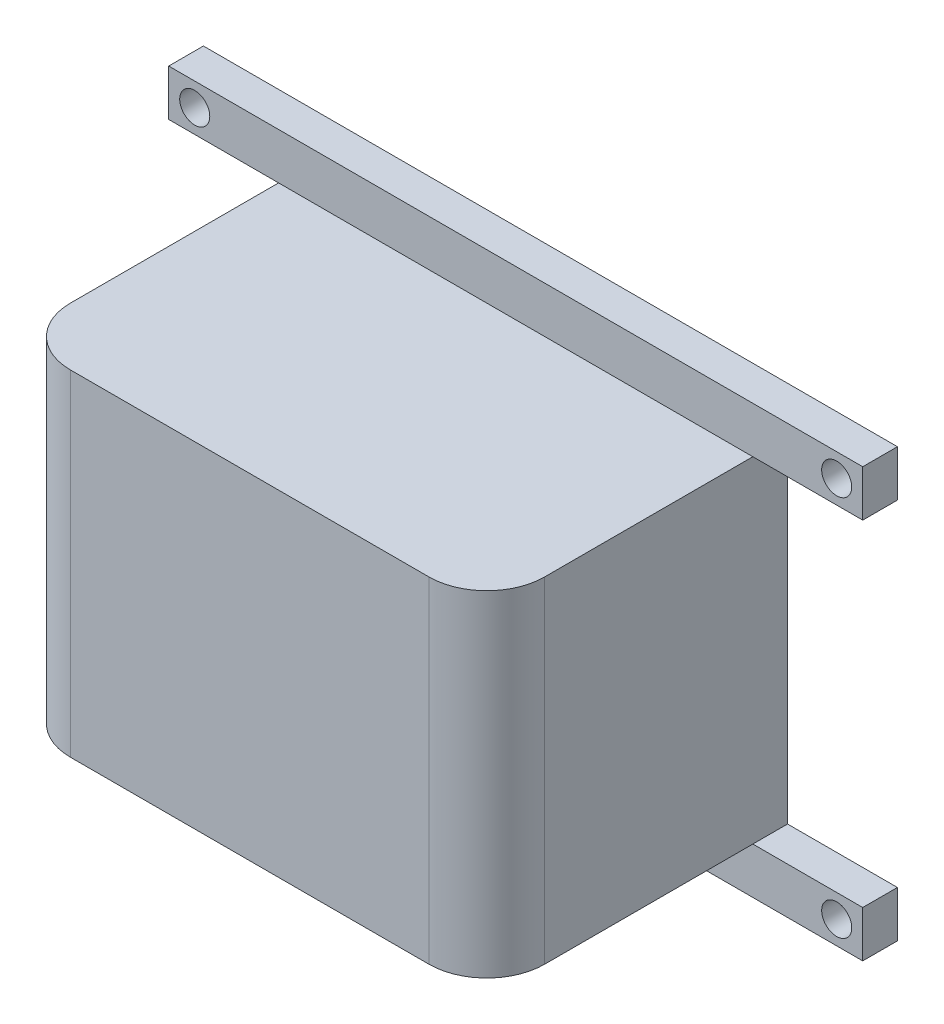
ISO-10303-21;
HEADER;
FILE_DESCRIPTION(('STEP AP214'),'2;1');
FILE_NAME('part.step','',(''),(''),'','','');
FILE_SCHEMA(('AUTOMOTIVE_DESIGN { 1 0 10303 214 1 1 1 1 }'));
ENDSEC;
DATA;
#1=APPLICATION_CONTEXT('core data for automotive mechanical design processes');
#2=APPLICATION_PROTOCOL_DEFINITION('international standard','automotive_design',2000,#1);
#3=PRODUCT_CONTEXT('',#1,'mechanical');
#4=PRODUCT('Part','Part','',(#3));
#5=PRODUCT_RELATED_PRODUCT_CATEGORY('part','',(#4));
#6=PRODUCT_DEFINITION_FORMATION('','',#4);
#7=PRODUCT_DEFINITION_CONTEXT('part definition',#1,'design');
#8=PRODUCT_DEFINITION('design','',#6,#7);
#9=PRODUCT_DEFINITION_SHAPE('','',#8);
#10=(LENGTH_UNIT() NAMED_UNIT(*) SI_UNIT(.MILLI.,.METRE.));
#11=(NAMED_UNIT(*) PLANE_ANGLE_UNIT() SI_UNIT($,.RADIAN.));
#12=(NAMED_UNIT(*) SI_UNIT($,.STERADIAN.) SOLID_ANGLE_UNIT());
#13=UNCERTAINTY_MEASURE_WITH_UNIT(LENGTH_MEASURE(1.E-05),#10,'distance_accuracy_value','');
#14=(GEOMETRIC_REPRESENTATION_CONTEXT(3) GLOBAL_UNCERTAINTY_ASSIGNED_CONTEXT((#13)) GLOBAL_UNIT_ASSIGNED_CONTEXT((#10,
#11,#12)) REPRESENTATION_CONTEXT('',''));
#15=CARTESIAN_POINT('',(0.,0.,0.));
#16=DIRECTION('',(0.,0.,1.));
#17=DIRECTION('',(1.,0.,0.));
#18=AXIS2_PLACEMENT_3D('',#15,#16,#17);
#19=CARTESIAN_POINT('',(0.,0.,30.));
#20=DIRECTION('',(0.,0.,1.));
#21=DIRECTION('',(1.,0.,0.));
#22=AXIS2_PLACEMENT_3D('',#19,#20,#21);
#23=PLANE('',#22);
#24=DIRECTION('',(-1.,0.,0.));
#25=VECTOR('',#24,1.);
#26=CARTESIAN_POINT('',(205.,145.,30.));
#27=LINE('',#26,#25);
#28=CARTESIAN_POINT('',(205.,145.,30.));
#29=VERTEX_POINT('',#28);
#30=CARTESIAN_POINT('',(-205.,145.,30.));
#31=VERTEX_POINT('',#30);
#32=EDGE_CURVE('E176',#29,#31,#27,.T.);
#33=ORIENTED_EDGE('',*,*,#32,.F.);
#34=DIRECTION('',(1.,0.,0.));
#35=VECTOR('',#34,1.);
#36=CARTESIAN_POINT('',(300.,145.,30.));
#37=LINE('',#36,#35);
#38=CARTESIAN_POINT('',(300.,145.,30.));
#39=VERTEX_POINT('',#38);
#40=EDGE_CURVE('E173',#29,#39,#37,.T.);
#41=ORIENTED_EDGE('',*,*,#40,.T.);
#42=DIRECTION('',(0.,1.,0.));
#43=VECTOR('',#42,1.);
#44=CARTESIAN_POINT('',(300.,185.,30.));
#45=LINE('',#44,#43);
#46=CARTESIAN_POINT('',(300.,185.,30.));
#47=VERTEX_POINT('',#46);
#48=EDGE_CURVE('E217',#39,#47,#45,.T.);
#49=ORIENTED_EDGE('',*,*,#48,.T.);
#50=DIRECTION('',(-1.,0.,0.));
#51=VECTOR('',#50,1.);
#52=CARTESIAN_POINT('',(300.,185.,30.));
#53=LINE('',#52,#51);
#54=CARTESIAN_POINT('',(-300.,185.,30.));
#55=VERTEX_POINT('',#54);
#56=EDGE_CURVE('E219',#47,#55,#53,.T.);
#57=ORIENTED_EDGE('',*,*,#56,.T.);
#58=DIRECTION('',(0.,-1.,0.));
#59=VECTOR('',#58,1.);
#60=CARTESIAN_POINT('',(-300.,185.,30.));
#61=LINE('',#60,#59);
#62=CARTESIAN_POINT('',(-300.,145.,30.));
#63=VERTEX_POINT('',#62);
#64=EDGE_CURVE('E221',#55,#63,#61,.T.);
#65=ORIENTED_EDGE('',*,*,#64,.T.);
#66=DIRECTION('',(1.,0.,0.));
#67=VECTOR('',#66,1.);
#68=CARTESIAN_POINT('',(-300.,145.,30.));
#69=LINE('',#68,#67);
#70=EDGE_CURVE('E223',#63,#31,#69,.T.);
#71=ORIENTED_EDGE('',*,*,#70,.T.);
#72=EDGE_LOOP('',(#33,#41,#49,#57,#65,#71));
#73=FACE_BOUND('',#72,.T.);
#74=CARTESIAN_POINT('',(-277.5,165.,30.));
#75=DIRECTION('',(0.,0.,1.));
#76=DIRECTION('',(1.,0.,0.));
#77=AXIS2_PLACEMENT_3D('',#74,#75,#76);
#78=CIRCLE('',#77,13.);
#79=CARTESIAN_POINT('',(-264.5,165.,30.));
#80=VERTEX_POINT('',#79);
#81=EDGE_CURVE('E201',#80,#80,#78,.T.);
#82=ORIENTED_EDGE('',*,*,#81,.F.);
#83=EDGE_LOOP('',(#82));
#84=FACE_BOUND('',#83,.T.);
#85=CARTESIAN_POINT('',(277.5,165.,30.));
#86=DIRECTION('',(0.,0.,1.));
#87=DIRECTION('',(1.,0.,0.));
#88=AXIS2_PLACEMENT_3D('',#85,#86,#87);
#89=CIRCLE('',#88,13.);
#90=CARTESIAN_POINT('',(290.5,165.,30.));
#91=VERTEX_POINT('',#90);
#92=EDGE_CURVE('E204',#91,#91,#89,.T.);
#93=ORIENTED_EDGE('',*,*,#92,.F.);
#94=EDGE_LOOP('',(#93));
#95=FACE_BOUND('',#94,.T.);
#96=ADVANCED_FACE('F33',(#73,#84,#95),#23,.T.);
#97=CARTESIAN_POINT('',(300.,-185.,30.));
#98=DIRECTION('',(-1.,0.,0.));
#99=DIRECTION('',(0.,-1.,0.));
#100=AXIS2_PLACEMENT_3D('',#97,#98,#99);
#101=PLANE('',#100);
#102=DIRECTION('',(0.,1.,0.));
#103=VECTOR('',#102,1.);
#104=CARTESIAN_POINT('',(300.,-185.,0.));
#105=LINE('',#104,#103);
#106=CARTESIAN_POINT('',(300.,-185.,0.));
#107=VERTEX_POINT('',#106);
#108=CARTESIAN_POINT('',(300.,-145.,0.));
#109=VERTEX_POINT('',#108);
#110=EDGE_CURVE('E213',#107,#109,#105,.T.);
#111=ORIENTED_EDGE('',*,*,#110,.T.);
#112=DIRECTION('',(0.,0.,-1.));
#113=VECTOR('',#112,1.);
#114=CARTESIAN_POINT('',(300.,-145.,30.));
#115=LINE('',#114,#113);
#116=CARTESIAN_POINT('',(300.,-145.,30.));
#117=VERTEX_POINT('',#116);
#118=EDGE_CURVE('E161',#117,#109,#115,.T.);
#119=ORIENTED_EDGE('',*,*,#118,.F.);
#120=DIRECTION('',(0.,1.,0.));
#121=VECTOR('',#120,1.);
#122=CARTESIAN_POINT('',(300.,-185.,30.));
#123=LINE('',#122,#121);
#124=CARTESIAN_POINT('',(300.,-185.,30.));
#125=VERTEX_POINT('',#124);
#126=EDGE_CURVE('E171',#125,#117,#123,.T.);
#127=ORIENTED_EDGE('',*,*,#126,.F.);
#128=DIRECTION('',(0.,0.,-1.));
#129=VECTOR('',#128,1.);
#130=CARTESIAN_POINT('',(300.,-185.,30.));
#131=LINE('',#130,#129);
#132=EDGE_CURVE('E232',#125,#107,#131,.T.);
#133=ORIENTED_EDGE('',*,*,#132,.T.);
#134=EDGE_LOOP('',(#111,#119,#127,#133));
#135=FACE_BOUND('',#134,.T.);
#136=ADVANCED_FACE('F343',(#135),#101,.F.);
#137=CARTESIAN_POINT('',(300.,-145.,30.));
#138=DIRECTION('',(0.,-1.,0.));
#139=DIRECTION('',(1.,0.,0.));
#140=AXIS2_PLACEMENT_3D('',#137,#138,#139);
#141=PLANE('',#140);
#142=DIRECTION('',(-1.,0.,0.));
#143=VECTOR('',#142,1.);
#144=CARTESIAN_POINT('',(300.,-145.,0.));
#145=LINE('',#144,#143);
#146=CARTESIAN_POINT('',(205.,-145.,0.));
#147=VERTEX_POINT('',#146);
#148=EDGE_CURVE('E160',#109,#147,#145,.T.);
#149=ORIENTED_EDGE('',*,*,#148,.T.);
#150=DIRECTION('',(0.,0.,-1.));
#151=VECTOR('',#150,1.);
#152=CARTESIAN_POINT('',(205.,-145.,30.));
#153=LINE('',#152,#151);
#154=CARTESIAN_POINT('',(205.,-145.,30.));
#155=VERTEX_POINT('',#154);
#156=EDGE_CURVE('E147',#155,#147,#153,.T.);
#157=ORIENTED_EDGE('',*,*,#156,.F.);
#158=DIRECTION('',(-1.,0.,0.));
#159=VECTOR('',#158,1.);
#160=CARTESIAN_POINT('',(300.,-145.,30.));
#161=LINE('',#160,#159);
#162=EDGE_CURVE('E158',#117,#155,#161,.T.);
#163=ORIENTED_EDGE('',*,*,#162,.F.);
#164=ORIENTED_EDGE('',*,*,#118,.T.);
#165=EDGE_LOOP('',(#149,#157,#163,#164));
#166=FACE_BOUND('',#165,.T.);
#167=ADVANCED_FACE('F156',(#166),#141,.F.);
#168=CARTESIAN_POINT('',(205.,145.,30.));
#169=DIRECTION('',(-1.,0.,0.));
#170=DIRECTION('',(0.,-1.,0.));
#171=AXIS2_PLACEMENT_3D('',#168,#169,#170);
#172=PLANE('',#171);
#173=DIRECTION('',(0.,0.,-1.));
#174=VECTOR('',#173,1.);
#175=CARTESIAN_POINT('',(205.,145.,260.));
#176=LINE('',#175,#174);
#177=CARTESIAN_POINT('',(205.,145.,210.));
#178=VERTEX_POINT('',#177);
#179=EDGE_CURVE('E152',#178,#29,#176,.T.);
#180=ORIENTED_EDGE('',*,*,#179,.F.);
#181=DIRECTION('',(0.,1.,0.));
#182=VECTOR('',#181,1.);
#183=CARTESIAN_POINT('',(205.,145.,210.));
#184=LINE('',#183,#182);
#185=CARTESIAN_POINT('',(205.,-145.,210.));
#186=VERTEX_POINT('',#185);
#187=EDGE_CURVE('E56',#178,#186,#184,.F.);
#188=ORIENTED_EDGE('',*,*,#187,.T.);
#189=DIRECTION('',(0.,0.,-1.));
#190=VECTOR('',#189,1.);
#191=CARTESIAN_POINT('',(205.,-145.,260.));
#192=LINE('',#191,#190);
#193=EDGE_CURVE('E144',#186,#155,#192,.T.);
#194=ORIENTED_EDGE('',*,*,#193,.T.);
#195=ORIENTED_EDGE('',*,*,#156,.T.);
#196=DIRECTION('',(0.,1.,0.));
#197=VECTOR('',#196,1.);
#198=CARTESIAN_POINT('',(205.,145.,0.));
#199=LINE('',#198,#197);
#200=CARTESIAN_POINT('',(205.,145.,0.));
#201=VERTEX_POINT('',#200);
#202=EDGE_CURVE('E236',#147,#201,#199,.T.);
#203=ORIENTED_EDGE('',*,*,#202,.T.);
#204=DIRECTION('',(0.,0.,-1.));
#205=VECTOR('',#204,1.);
#206=CARTESIAN_POINT('',(205.,145.,30.));
#207=LINE('',#206,#205);
#208=EDGE_CURVE('E162',#29,#201,#207,.T.);
#209=ORIENTED_EDGE('',*,*,#208,.F.);
#210=EDGE_LOOP('',(#180,#188,#194,#195,#203,#209));
#211=FACE_BOUND('',#210,.T.);
#212=ADVANCED_FACE('F146',(#211),#172,.F.);
#213=CARTESIAN_POINT('',(300.,145.,30.));
#214=DIRECTION('',(0.,1.,0.));
#215=DIRECTION('',(-1.,0.,0.));
#216=AXIS2_PLACEMENT_3D('',#213,#214,#215);
#217=PLANE('',#216);
#218=DIRECTION('',(1.,0.,0.));
#219=VECTOR('',#218,1.);
#220=CARTESIAN_POINT('',(300.,145.,0.));
#221=LINE('',#220,#219);
#222=CARTESIAN_POINT('',(300.,145.,0.));
#223=VERTEX_POINT('',#222);
#224=EDGE_CURVE('E238',#201,#223,#221,.T.);
#225=ORIENTED_EDGE('',*,*,#224,.T.);
#226=DIRECTION('',(0.,0.,-1.));
#227=VECTOR('',#226,1.);
#228=CARTESIAN_POINT('',(300.,145.,30.));
#229=LINE('',#228,#227);
#230=EDGE_CURVE('E278',#39,#223,#229,.T.);
#231=ORIENTED_EDGE('',*,*,#230,.F.);
#232=ORIENTED_EDGE('',*,*,#40,.F.);
#233=ORIENTED_EDGE('',*,*,#208,.T.);
#234=EDGE_LOOP('',(#225,#231,#232,#233));
#235=FACE_BOUND('',#234,.T.);
#236=ADVANCED_FACE('F312',(#235),#217,.F.);
#237=CARTESIAN_POINT('',(300.,185.,30.));
#238=DIRECTION('',(-1.,0.,0.));
#239=DIRECTION('',(0.,-1.,0.));
#240=AXIS2_PLACEMENT_3D('',#237,#238,#239);
#241=PLANE('',#240);
#242=DIRECTION('',(0.,1.,0.));
#243=VECTOR('',#242,1.);
#244=CARTESIAN_POINT('',(300.,185.,0.));
#245=LINE('',#244,#243);
#246=CARTESIAN_POINT('',(300.,185.,0.));
#247=VERTEX_POINT('',#246);
#248=EDGE_CURVE('E240',#223,#247,#245,.T.);
#249=ORIENTED_EDGE('',*,*,#248,.T.);
#250=DIRECTION('',(0.,0.,-1.));
#251=VECTOR('',#250,1.);
#252=CARTESIAN_POINT('',(300.,185.,30.));
#253=LINE('',#252,#251);
#254=EDGE_CURVE('E275',#47,#247,#253,.T.);
#255=ORIENTED_EDGE('',*,*,#254,.F.);
#256=ORIENTED_EDGE('',*,*,#48,.F.);
#257=ORIENTED_EDGE('',*,*,#230,.T.);
#258=EDGE_LOOP('',(#249,#255,#256,#257));
#259=FACE_BOUND('',#258,.T.);
#260=ADVANCED_FACE('F349',(#259),#241,.F.);
#261=CARTESIAN_POINT('',(300.,185.,30.));
#262=DIRECTION('',(0.,-1.,0.));
#263=DIRECTION('',(1.,0.,0.));
#264=AXIS2_PLACEMENT_3D('',#261,#262,#263);
#265=PLANE('',#264);
#266=DIRECTION('',(-1.,0.,0.));
#267=VECTOR('',#266,1.);
#268=CARTESIAN_POINT('',(300.,185.,0.));
#269=LINE('',#268,#267);
#270=CARTESIAN_POINT('',(-300.,185.,0.));
#271=VERTEX_POINT('',#270);
#272=EDGE_CURVE('E242',#247,#271,#269,.T.);
#273=ORIENTED_EDGE('',*,*,#272,.T.);
#274=DIRECTION('',(0.,0.,-1.));
#275=VECTOR('',#274,1.);
#276=CARTESIAN_POINT('',(-300.,185.,30.));
#277=LINE('',#276,#275);
#278=EDGE_CURVE('E272',#55,#271,#277,.T.);
#279=ORIENTED_EDGE('',*,*,#278,.F.);
#280=ORIENTED_EDGE('',*,*,#56,.F.);
#281=ORIENTED_EDGE('',*,*,#254,.T.);
#282=EDGE_LOOP('',(#273,#279,#280,#281));
#283=FACE_BOUND('',#282,.T.);
#284=ADVANCED_FACE('F353',(#283),#265,.F.);
#285=CARTESIAN_POINT('',(-300.,185.,30.));
#286=DIRECTION('',(1.,0.,0.));
#287=DIRECTION('',(0.,1.,0.));
#288=AXIS2_PLACEMENT_3D('',#285,#286,#287);
#289=PLANE('',#288);
#290=DIRECTION('',(0.,-1.,0.));
#291=VECTOR('',#290,1.);
#292=CARTESIAN_POINT('',(-300.,185.,0.));
#293=LINE('',#292,#291);
#294=CARTESIAN_POINT('',(-300.,145.,0.));
#295=VERTEX_POINT('',#294);
#296=EDGE_CURVE('E244',#271,#295,#293,.T.);
#297=ORIENTED_EDGE('',*,*,#296,.T.);
#298=DIRECTION('',(0.,0.,-1.));
#299=VECTOR('',#298,1.);
#300=CARTESIAN_POINT('',(-300.,145.,30.));
#301=LINE('',#300,#299);
#302=EDGE_CURVE('E269',#63,#295,#301,.T.);
#303=ORIENTED_EDGE('',*,*,#302,.F.);
#304=ORIENTED_EDGE('',*,*,#64,.F.);
#305=ORIENTED_EDGE('',*,*,#278,.T.);
#306=EDGE_LOOP('',(#297,#303,#304,#305));
#307=FACE_BOUND('',#306,.T.);
#308=ADVANCED_FACE('F357',(#307),#289,.F.);
#309=CARTESIAN_POINT('',(-300.,145.,30.));
#310=DIRECTION('',(0.,1.,0.));
#311=DIRECTION('',(0.,0.,1.));
#312=AXIS2_PLACEMENT_3D('',#309,#310,#311);
#313=PLANE('',#312);
#314=DIRECTION('',(1.,0.,0.));
#315=VECTOR('',#314,1.);
#316=CARTESIAN_POINT('',(-300.,145.,0.));
#317=LINE('',#316,#315);
#318=CARTESIAN_POINT('',(-205.,145.,0.));
#319=VERTEX_POINT('',#318);
#320=EDGE_CURVE('E246',#295,#319,#317,.T.);
#321=ORIENTED_EDGE('',*,*,#320,.T.);
#322=DIRECTION('',(0.,0.,-1.));
#323=VECTOR('',#322,1.);
#324=CARTESIAN_POINT('',(-205.,145.,30.));
#325=LINE('',#324,#323);
#326=EDGE_CURVE('E266',#31,#319,#325,.T.);
#327=ORIENTED_EDGE('',*,*,#326,.F.);
#328=ORIENTED_EDGE('',*,*,#70,.F.);
#329=ORIENTED_EDGE('',*,*,#302,.T.);
#330=EDGE_LOOP('',(#321,#327,#328,#329));
#331=FACE_BOUND('',#330,.T.);
#332=ADVANCED_FACE('F361',(#331),#313,.F.);
#333=CARTESIAN_POINT('',(-205.,145.,30.));
#334=DIRECTION('',(1.,0.,0.));
#335=DIRECTION('',(0.,1.,0.));
#336=AXIS2_PLACEMENT_3D('',#333,#334,#335);
#337=PLANE('',#336);
#338=DIRECTION('',(0.,0.,-1.));
#339=VECTOR('',#338,1.);
#340=CARTESIAN_POINT('',(-205.,-145.,260.));
#341=LINE('',#340,#339);
#342=CARTESIAN_POINT('',(-205.,-145.,210.));
#343=VERTEX_POINT('',#342);
#344=CARTESIAN_POINT('',(-205.,-145.,30.));
#345=VERTEX_POINT('',#344);
#346=EDGE_CURVE('E151',#343,#345,#341,.T.);
#347=ORIENTED_EDGE('',*,*,#346,.F.);
#348=DIRECTION('',(0.,-1.,0.));
#349=VECTOR('',#348,1.);
#350=CARTESIAN_POINT('',(-205.,145.,210.));
#351=LINE('',#350,#349);
#352=CARTESIAN_POINT('',(-205.,145.,210.));
#353=VERTEX_POINT('',#352);
#354=EDGE_CURVE('E11',#343,#353,#351,.F.);
#355=ORIENTED_EDGE('',*,*,#354,.T.);
#356=DIRECTION('',(0.,0.,-1.));
#357=VECTOR('',#356,1.);
#358=CARTESIAN_POINT('',(-205.,145.,260.));
#359=LINE('',#358,#357);
#360=EDGE_CURVE('E185',#353,#31,#359,.T.);
#361=ORIENTED_EDGE('',*,*,#360,.T.);
#362=ORIENTED_EDGE('',*,*,#326,.T.);
#363=DIRECTION('',(0.,-1.,0.));
#364=VECTOR('',#363,1.);
#365=CARTESIAN_POINT('',(-205.,145.,0.));
#366=LINE('',#365,#364);
#367=CARTESIAN_POINT('',(-205.,-145.,0.));
#368=VERTEX_POINT('',#367);
#369=EDGE_CURVE('E248',#319,#368,#366,.T.);
#370=ORIENTED_EDGE('',*,*,#369,.T.);
#371=DIRECTION('',(0.,0.,-1.));
#372=VECTOR('',#371,1.);
#373=CARTESIAN_POINT('',(-205.,-145.,30.));
#374=LINE('',#373,#372);
#375=EDGE_CURVE('E263',#345,#368,#374,.T.);
#376=ORIENTED_EDGE('',*,*,#375,.F.);
#377=EDGE_LOOP('',(#347,#355,#361,#362,#370,#376));
#378=FACE_BOUND('',#377,.T.);
#379=ADVANCED_FACE('F324',(#378),#337,.F.);
#380=CARTESIAN_POINT('',(-300.,-145.,30.));
#381=DIRECTION('',(0.,-1.,0.));
#382=DIRECTION('',(0.,0.,-1.));
#383=AXIS2_PLACEMENT_3D('',#380,#381,#382);
#384=PLANE('',#383);
#385=DIRECTION('',(-1.,0.,0.));
#386=VECTOR('',#385,1.);
#387=CARTESIAN_POINT('',(-300.,-145.,0.));
#388=LINE('',#387,#386);
#389=CARTESIAN_POINT('',(-300.,-145.,0.));
#390=VERTEX_POINT('',#389);
#391=EDGE_CURVE('E250',#368,#390,#388,.T.);
#392=ORIENTED_EDGE('',*,*,#391,.T.);
#393=DIRECTION('',(0.,0.,-1.));
#394=VECTOR('',#393,1.);
#395=CARTESIAN_POINT('',(-300.,-145.,30.));
#396=LINE('',#395,#394);
#397=CARTESIAN_POINT('',(-300.,-145.,30.));
#398=VERTEX_POINT('',#397);
#399=EDGE_CURVE('E260',#398,#390,#396,.T.);
#400=ORIENTED_EDGE('',*,*,#399,.F.);
#401=DIRECTION('',(-1.,0.,0.));
#402=VECTOR('',#401,1.);
#403=CARTESIAN_POINT('',(-300.,-145.,30.));
#404=LINE('',#403,#402);
#405=EDGE_CURVE('E226',#345,#398,#404,.T.);
#406=ORIENTED_EDGE('',*,*,#405,.F.);
#407=ORIENTED_EDGE('',*,*,#375,.T.);
#408=EDGE_LOOP('',(#392,#400,#406,#407));
#409=FACE_BOUND('',#408,.T.);
#410=ADVANCED_FACE('F330',(#409),#384,.F.);
#411=CARTESIAN_POINT('',(-300.,-185.,30.));
#412=DIRECTION('',(1.,0.,0.));
#413=DIRECTION('',(0.,1.,0.));
#414=AXIS2_PLACEMENT_3D('',#411,#412,#413);
#415=PLANE('',#414);
#416=DIRECTION('',(0.,-1.,0.));
#417=VECTOR('',#416,1.);
#418=CARTESIAN_POINT('',(-300.,-185.,0.));
#419=LINE('',#418,#417);
#420=CARTESIAN_POINT('',(-300.,-185.,0.));
#421=VERTEX_POINT('',#420);
#422=EDGE_CURVE('E252',#390,#421,#419,.T.);
#423=ORIENTED_EDGE('',*,*,#422,.T.);
#424=DIRECTION('',(0.,0.,-1.));
#425=VECTOR('',#424,1.);
#426=CARTESIAN_POINT('',(-300.,-185.,30.));
#427=LINE('',#426,#425);
#428=CARTESIAN_POINT('',(-300.,-185.,30.));
#429=VERTEX_POINT('',#428);
#430=EDGE_CURVE('E257',#429,#421,#427,.T.);
#431=ORIENTED_EDGE('',*,*,#430,.F.);
#432=DIRECTION('',(0.,-1.,0.));
#433=VECTOR('',#432,1.);
#434=CARTESIAN_POINT('',(-300.,-185.,30.));
#435=LINE('',#434,#433);
#436=EDGE_CURVE('E228',#398,#429,#435,.T.);
#437=ORIENTED_EDGE('',*,*,#436,.F.);
#438=ORIENTED_EDGE('',*,*,#399,.T.);
#439=EDGE_LOOP('',(#423,#431,#437,#438));
#440=FACE_BOUND('',#439,.T.);
#441=ADVANCED_FACE('F336',(#440),#415,.F.);
#442=CARTESIAN_POINT('',(300.,-185.,30.));
#443=DIRECTION('',(0.,1.,0.));
#444=DIRECTION('',(0.,0.,1.));
#445=AXIS2_PLACEMENT_3D('',#442,#443,#444);
#446=PLANE('',#445);
#447=DIRECTION('',(1.,0.,0.));
#448=VECTOR('',#447,1.);
#449=CARTESIAN_POINT('',(300.,-185.,0.));
#450=LINE('',#449,#448);
#451=EDGE_CURVE('E214',#421,#107,#450,.T.);
#452=ORIENTED_EDGE('',*,*,#451,.T.);
#453=ORIENTED_EDGE('',*,*,#132,.F.);
#454=DIRECTION('',(1.,0.,0.));
#455=VECTOR('',#454,1.);
#456=CARTESIAN_POINT('',(300.,-185.,30.));
#457=LINE('',#456,#455);
#458=EDGE_CURVE('E230',#429,#125,#457,.T.);
#459=ORIENTED_EDGE('',*,*,#458,.F.);
#460=ORIENTED_EDGE('',*,*,#430,.T.);
#461=EDGE_LOOP('',(#452,#453,#459,#460));
#462=FACE_BOUND('',#461,.T.);
#463=ADVANCED_FACE('F340',(#462),#446,.F.);
#464=DIRECTION('',(1.,0.,0.));
#465=VECTOR('',#464,1.);
#466=CARTESIAN_POINT('',(205.,-145.,30.));
#467=LINE('',#466,#465);
#468=EDGE_CURVE('E168',#345,#155,#467,.T.);
#469=ORIENTED_EDGE('',*,*,#468,.F.);
#470=ORIENTED_EDGE('',*,*,#405,.T.);
#471=ORIENTED_EDGE('',*,*,#436,.T.);
#472=ORIENTED_EDGE('',*,*,#458,.T.);
#473=ORIENTED_EDGE('',*,*,#126,.T.);
#474=ORIENTED_EDGE('',*,*,#162,.T.);
#475=EDGE_LOOP('',(#469,#470,#471,#472,#473,#474));
#476=FACE_BOUND('',#475,.T.);
#477=CARTESIAN_POINT('',(-277.5,-165.,30.));
#478=DIRECTION('',(0.,0.,1.));
#479=DIRECTION('',(1.,0.,0.));
#480=AXIS2_PLACEMENT_3D('',#477,#478,#479);
#481=CIRCLE('',#480,13.);
#482=CARTESIAN_POINT('',(-264.5,-165.,30.));
#483=VERTEX_POINT('',#482);
#484=EDGE_CURVE('E210',#483,#483,#481,.T.);
#485=ORIENTED_EDGE('',*,*,#484,.F.);
#486=EDGE_LOOP('',(#485));
#487=FACE_BOUND('',#486,.T.);
#488=CARTESIAN_POINT('',(277.5,-165.,30.));
#489=DIRECTION('',(0.,0.,1.));
#490=DIRECTION('',(1.,0.,0.));
#491=AXIS2_PLACEMENT_3D('',#488,#489,#490);
#492=CIRCLE('',#491,13.);
#493=CARTESIAN_POINT('',(290.5,-165.,30.));
#494=VERTEX_POINT('',#493);
#495=EDGE_CURVE('E207',#494,#494,#492,.T.);
#496=ORIENTED_EDGE('',*,*,#495,.F.);
#497=EDGE_LOOP('',(#496));
#498=FACE_BOUND('',#497,.T.);
#499=ADVANCED_FACE('F166',(#476,#487,#498),#23,.T.);
#500=CARTESIAN_POINT('',(0.,0.,0.));
#501=DIRECTION('',(0.,0.,1.));
#502=DIRECTION('',(1.,0.,0.));
#503=AXIS2_PLACEMENT_3D('',#500,#501,#502);
#504=PLANE('',#503);
#505=CARTESIAN_POINT('',(-277.5,-165.,0.));
#506=DIRECTION('',(0.,0.,1.));
#507=DIRECTION('',(-1.,0.,0.));
#508=AXIS2_PLACEMENT_3D('',#505,#506,#507);
#509=CIRCLE('',#508,13.);
#510=CARTESIAN_POINT('',(-290.5,-165.,0.));
#511=VERTEX_POINT('',#510);
#512=EDGE_CURVE('E189',#511,#511,#509,.T.);
#513=ORIENTED_EDGE('',*,*,#512,.T.);
#514=EDGE_LOOP('',(#513));
#515=FACE_BOUND('',#514,.T.);
#516=CARTESIAN_POINT('',(277.5,-165.,0.));
#517=DIRECTION('',(0.,0.,1.));
#518=DIRECTION('',(1.,0.,0.));
#519=AXIS2_PLACEMENT_3D('',#516,#517,#518);
#520=CIRCLE('',#519,13.);
#521=CARTESIAN_POINT('',(290.5,-165.,0.));
#522=VERTEX_POINT('',#521);
#523=EDGE_CURVE('E194',#522,#522,#520,.T.);
#524=ORIENTED_EDGE('',*,*,#523,.T.);
#525=EDGE_LOOP('',(#524));
#526=FACE_BOUND('',#525,.T.);
#527=CARTESIAN_POINT('',(277.5,165.,0.));
#528=DIRECTION('',(0.,0.,1.));
#529=DIRECTION('',(-1.,0.,0.));
#530=AXIS2_PLACEMENT_3D('',#527,#528,#529);
#531=CIRCLE('',#530,13.);
#532=CARTESIAN_POINT('',(264.5,165.,0.));
#533=VERTEX_POINT('',#532);
#534=EDGE_CURVE('E190',#533,#533,#531,.T.);
#535=ORIENTED_EDGE('',*,*,#534,.T.);
#536=EDGE_LOOP('',(#535));
#537=FACE_BOUND('',#536,.T.);
#538=CARTESIAN_POINT('',(-277.5,165.,0.));
#539=DIRECTION('',(0.,0.,1.));
#540=DIRECTION('',(1.,0.,0.));
#541=AXIS2_PLACEMENT_3D('',#538,#539,#540);
#542=CIRCLE('',#541,13.);
#543=CARTESIAN_POINT('',(-264.5,165.,0.));
#544=VERTEX_POINT('',#543);
#545=EDGE_CURVE('E193',#544,#544,#542,.T.);
#546=ORIENTED_EDGE('',*,*,#545,.T.);
#547=EDGE_LOOP('',(#546));
#548=FACE_BOUND('',#547,.T.);
#549=ORIENTED_EDGE('',*,*,#110,.F.);
#550=ORIENTED_EDGE('',*,*,#451,.F.);
#551=ORIENTED_EDGE('',*,*,#422,.F.);
#552=ORIENTED_EDGE('',*,*,#391,.F.);
#553=ORIENTED_EDGE('',*,*,#369,.F.);
#554=ORIENTED_EDGE('',*,*,#320,.F.);
#555=ORIENTED_EDGE('',*,*,#296,.F.);
#556=ORIENTED_EDGE('',*,*,#272,.F.);
#557=ORIENTED_EDGE('',*,*,#248,.F.);
#558=ORIENTED_EDGE('',*,*,#224,.F.);
#559=ORIENTED_EDGE('',*,*,#202,.F.);
#560=ORIENTED_EDGE('',*,*,#148,.F.);
#561=EDGE_LOOP('',(#549,#550,#551,#552,#553,#554,#555,#556,#557,#558,#559,#560));
#562=FACE_BOUND('',#561,.T.);
#563=ADVANCED_FACE('F345',(#515,#526,#537,#548,#562),#504,.F.);
#564=CARTESIAN_POINT('',(-277.5,165.,0.));
#565=DIRECTION('',(0.,0.,1.));
#566=DIRECTION('',(1.,0.,0.));
#567=AXIS2_PLACEMENT_3D('',#564,#565,#566);
#568=CYLINDRICAL_SURFACE('',#567,13.);
#569=ORIENTED_EDGE('',*,*,#81,.T.);
#570=EDGE_LOOP('',(#569));
#571=FACE_BOUND('',#570,.T.);
#572=ORIENTED_EDGE('',*,*,#545,.F.);
#573=EDGE_LOOP('',(#572));
#574=FACE_BOUND('',#573,.T.);
#575=ADVANCED_FACE('F383',(#571,#574),#568,.F.);
#576=CARTESIAN_POINT('',(277.5,165.,0.));
#577=DIRECTION('',(0.,0.,1.));
#578=DIRECTION('',(1.,0.,0.));
#579=AXIS2_PLACEMENT_3D('',#576,#577,#578);
#580=CYLINDRICAL_SURFACE('',#579,13.);
#581=ORIENTED_EDGE('',*,*,#92,.T.);
#582=EDGE_LOOP('',(#581));
#583=FACE_BOUND('',#582,.T.);
#584=ORIENTED_EDGE('',*,*,#534,.F.);
#585=EDGE_LOOP('',(#584));
#586=FACE_BOUND('',#585,.T.);
#587=ADVANCED_FACE('F424',(#583,#586),#580,.F.);
#588=CARTESIAN_POINT('',(277.5,-165.,0.));
#589=DIRECTION('',(0.,0.,1.));
#590=DIRECTION('',(1.,0.,0.));
#591=AXIS2_PLACEMENT_3D('',#588,#589,#590);
#592=CYLINDRICAL_SURFACE('',#591,13.);
#593=ORIENTED_EDGE('',*,*,#495,.T.);
#594=EDGE_LOOP('',(#593));
#595=FACE_BOUND('',#594,.T.);
#596=ORIENTED_EDGE('',*,*,#523,.F.);
#597=EDGE_LOOP('',(#596));
#598=FACE_BOUND('',#597,.T.);
#599=ADVANCED_FACE('F433',(#595,#598),#592,.F.);
#600=CARTESIAN_POINT('',(-277.5,-165.,0.));
#601=DIRECTION('',(0.,0.,1.));
#602=DIRECTION('',(1.,0.,0.));
#603=AXIS2_PLACEMENT_3D('',#600,#601,#602);
#604=CYLINDRICAL_SURFACE('',#603,13.);
#605=ORIENTED_EDGE('',*,*,#484,.T.);
#606=EDGE_LOOP('',(#605));
#607=FACE_BOUND('',#606,.T.);
#608=ORIENTED_EDGE('',*,*,#512,.F.);
#609=EDGE_LOOP('',(#608));
#610=FACE_BOUND('',#609,.T.);
#611=ADVANCED_FACE('F443',(#607,#610),#604,.F.);
#612=CARTESIAN_POINT('',(205.,-145.,260.));
#613=DIRECTION('',(0.,1.,0.));
#614=DIRECTION('',(-1.,0.,0.));
#615=AXIS2_PLACEMENT_3D('',#612,#613,#614);
#616=PLANE('',#615);
#617=ORIENTED_EDGE('',*,*,#193,.F.);
#618=CARTESIAN_POINT('',(155.,-145.,210.));
#619=DIRECTION('',(0.,1.,0.));
#620=DIRECTION('',(-1.,0.,0.));
#621=AXIS2_PLACEMENT_3D('',#618,#619,#620);
#622=CIRCLE('',#621,50.);
#623=CARTESIAN_POINT('',(155.,-145.,260.));
#624=VERTEX_POINT('',#623);
#625=EDGE_CURVE('E41',#186,#624,#622,.F.);
#626=ORIENTED_EDGE('',*,*,#625,.T.);
#627=DIRECTION('',(1.,0.,0.));
#628=VECTOR('',#627,1.);
#629=CARTESIAN_POINT('',(205.,-145.,260.));
#630=LINE('',#629,#628);
#631=CARTESIAN_POINT('',(-155.,-145.,260.));
#632=VERTEX_POINT('',#631);
#633=EDGE_CURVE('E179',#632,#624,#630,.T.);
#634=ORIENTED_EDGE('',*,*,#633,.F.);
#635=CARTESIAN_POINT('',(-155.,-145.,210.));
#636=DIRECTION('',(0.,1.,0.));
#637=DIRECTION('',(-1.,0.,0.));
#638=AXIS2_PLACEMENT_3D('',#635,#636,#637);
#639=CIRCLE('',#638,50.);
#640=EDGE_CURVE('E48',#632,#343,#639,.F.);
#641=ORIENTED_EDGE('',*,*,#640,.T.);
#642=ORIENTED_EDGE('',*,*,#346,.T.);
#643=ORIENTED_EDGE('',*,*,#468,.T.);
#644=EDGE_LOOP('',(#617,#626,#634,#641,#642,#643));
#645=FACE_BOUND('',#644,.T.);
#646=ADVANCED_FACE('F175',(#645),#616,.F.);
#647=CARTESIAN_POINT('',(205.,145.,260.));
#648=DIRECTION('',(0.,-1.,0.));
#649=DIRECTION('',(0.,0.,-1.));
#650=AXIS2_PLACEMENT_3D('',#647,#648,#649);
#651=PLANE('',#650);
#652=DIRECTION('',(-1.,0.,0.));
#653=VECTOR('',#652,1.);
#654=CARTESIAN_POINT('',(205.,145.,260.));
#655=LINE('',#654,#653);
#656=CARTESIAN_POINT('',(155.,145.,260.));
#657=VERTEX_POINT('',#656);
#658=CARTESIAN_POINT('',(-155.,145.,260.));
#659=VERTEX_POINT('',#658);
#660=EDGE_CURVE('E182',#657,#659,#655,.T.);
#661=ORIENTED_EDGE('',*,*,#660,.F.);
#662=CARTESIAN_POINT('',(155.,145.,210.));
#663=DIRECTION('',(0.,-1.,0.));
#664=DIRECTION('',(0.,0.,-1.));
#665=AXIS2_PLACEMENT_3D('',#662,#663,#664);
#666=CIRCLE('',#665,50.);
#667=EDGE_CURVE('E292',#657,#178,#666,.F.);
#668=ORIENTED_EDGE('',*,*,#667,.T.);
#669=ORIENTED_EDGE('',*,*,#179,.T.);
#670=ORIENTED_EDGE('',*,*,#32,.T.);
#671=ORIENTED_EDGE('',*,*,#360,.F.);
#672=CARTESIAN_POINT('',(-155.,145.,210.));
#673=DIRECTION('',(0.,-1.,0.));
#674=DIRECTION('',(0.,0.,-1.));
#675=AXIS2_PLACEMENT_3D('',#672,#673,#674);
#676=CIRCLE('',#675,50.);
#677=EDGE_CURVE('E290',#353,#659,#676,.F.);
#678=ORIENTED_EDGE('',*,*,#677,.T.);
#679=EDGE_LOOP('',(#661,#668,#669,#670,#671,#678));
#680=FACE_BOUND('',#679,.T.);
#681=ADVANCED_FACE('F305',(#680),#651,.F.);
#682=CARTESIAN_POINT('',(0.,0.,260.));
#683=DIRECTION('',(0.,0.,-1.));
#684=DIRECTION('',(-1.,0.,0.));
#685=AXIS2_PLACEMENT_3D('',#682,#683,#684);
#686=PLANE('',#685);
#687=ORIENTED_EDGE('',*,*,#633,.T.);
#688=DIRECTION('',(0.,1.,0.));
#689=VECTOR('',#688,1.);
#690=CARTESIAN_POINT('',(155.,0.,260.));
#691=LINE('',#690,#689);
#692=EDGE_CURVE('E287',#624,#657,#691,.T.);
#693=ORIENTED_EDGE('',*,*,#692,.T.);
#694=ORIENTED_EDGE('',*,*,#660,.T.);
#695=DIRECTION('',(0.,-1.,0.));
#696=VECTOR('',#695,1.);
#697=CARTESIAN_POINT('',(-155.,0.,260.));
#698=LINE('',#697,#696);
#699=EDGE_CURVE('E284',#659,#632,#698,.T.);
#700=ORIENTED_EDGE('',*,*,#699,.T.);
#701=EDGE_LOOP('',(#687,#693,#694,#700));
#702=FACE_BOUND('',#701,.T.);
#703=ADVANCED_FACE('F299',(#702),#686,.F.);
#704=CARTESIAN_POINT('',(155.,0.,210.));
#705=DIRECTION('',(0.,1.,0.));
#706=DIRECTION('',(-1.,0.,0.));
#707=AXIS2_PLACEMENT_3D('',#704,#705,#706);
#708=CYLINDRICAL_SURFACE('',#707,50.);
#709=ORIENTED_EDGE('',*,*,#625,.F.);
#710=ORIENTED_EDGE('',*,*,#187,.F.);
#711=ORIENTED_EDGE('',*,*,#667,.F.);
#712=ORIENTED_EDGE('',*,*,#692,.F.);
#713=EDGE_LOOP('',(#709,#710,#711,#712));
#714=FACE_BOUND('',#713,.T.);
#715=ADVANCED_FACE('F303',(#714),#708,.T.);
#716=CARTESIAN_POINT('',(-155.,0.,210.));
#717=DIRECTION('',(0.,-1.,0.));
#718=DIRECTION('',(1.,0.,0.));
#719=AXIS2_PLACEMENT_3D('',#716,#717,#718);
#720=CYLINDRICAL_SURFACE('',#719,50.);
#721=ORIENTED_EDGE('',*,*,#677,.F.);
#722=ORIENTED_EDGE('',*,*,#354,.F.);
#723=ORIENTED_EDGE('',*,*,#640,.F.);
#724=ORIENTED_EDGE('',*,*,#699,.F.);
#725=EDGE_LOOP('',(#721,#722,#723,#724));
#726=FACE_BOUND('',#725,.T.);
#727=ADVANCED_FACE('F35',(#726),#720,.T.);
#728=CLOSED_SHELL('',(#96,#136,#167,#212,#236,#260,#284,#308,#332,#379,#410,#441,#463,#499,#563,
#575,#587,#599,#611,#646,#681,#703,#715,#727));
#729=MANIFOLD_SOLID_BREP('B2',#728);
#730=ADVANCED_BREP_SHAPE_REPRESENTATION('',(#18,#729),#14);
#731=SHAPE_DEFINITION_REPRESENTATION(#9,#730);
ENDSEC;
END-ISO-10303-21;
